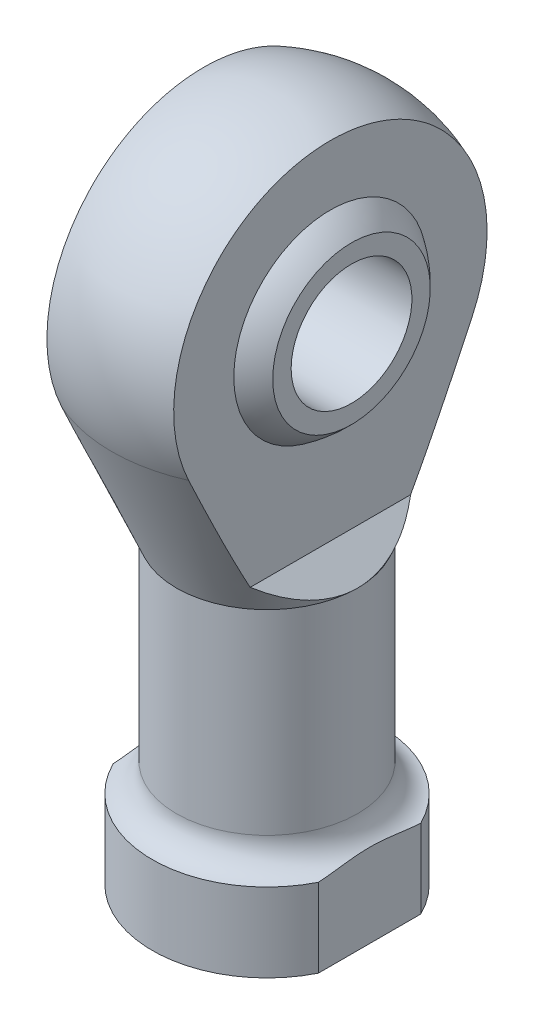
ISO-10303-21;
HEADER;
FILE_DESCRIPTION(('STEP AP214'),'2;1');
FILE_NAME('part.step','',(''),(''),'','','');
FILE_SCHEMA(('AUTOMOTIVE_DESIGN { 1 0 10303 214 1 1 1 1 }'));
ENDSEC;
DATA;
#1=APPLICATION_CONTEXT('core data for automotive mechanical design processes');
#2=APPLICATION_PROTOCOL_DEFINITION('international standard','automotive_design',2000,#1);
#3=PRODUCT_CONTEXT('',#1,'mechanical');
#4=PRODUCT('Part','Part','',(#3));
#5=PRODUCT_RELATED_PRODUCT_CATEGORY('part','',(#4));
#6=PRODUCT_DEFINITION_FORMATION('','',#4);
#7=PRODUCT_DEFINITION_CONTEXT('part definition',#1,'design');
#8=PRODUCT_DEFINITION('design','',#6,#7);
#9=PRODUCT_DEFINITION_SHAPE('','',#8);
#10=(LENGTH_UNIT() NAMED_UNIT(*) SI_UNIT(.MILLI.,.METRE.));
#11=(NAMED_UNIT(*) PLANE_ANGLE_UNIT() SI_UNIT($,.RADIAN.));
#12=(NAMED_UNIT(*) SI_UNIT($,.STERADIAN.) SOLID_ANGLE_UNIT());
#13=UNCERTAINTY_MEASURE_WITH_UNIT(LENGTH_MEASURE(1.E-05),#10,'distance_accuracy_value','');
#14=(GEOMETRIC_REPRESENTATION_CONTEXT(3) GLOBAL_UNCERTAINTY_ASSIGNED_CONTEXT((#13)) GLOBAL_UNIT_ASSIGNED_CONTEXT((#10,
#11,#12)) REPRESENTATION_CONTEXT('',''));
#15=CARTESIAN_POINT('',(0.,0.,0.));
#16=DIRECTION('',(0.,0.,1.));
#17=DIRECTION('',(1.,0.,0.));
#18=AXIS2_PLACEMENT_3D('',#15,#16,#17);
#19=CARTESIAN_POINT('',(0.,-18.,0.));
#20=DIRECTION('',(0.,1.,0.));
#21=DIRECTION('',(-1.,0.,0.));
#22=AXIS2_PLACEMENT_3D('',#19,#20,#21);
#23=CONICAL_SURFACE('',#22,7.5,0.4060598652);
#24=CARTESIAN_POINT('',(5.25,-15.7500000000467,-6.64336751220229));
#25=CARTESIAN_POINT('',(5.25,-15.5412590257444,-6.75775113915597));
#26=CARTESIAN_POINT('',(5.25,-15.3320480179548,-6.87127233524981));
#27=CARTESIAN_POINT('',(5.25,-14.912804278486,-7.09678085794804));
#28=CARTESIAN_POINT('',(5.25,-14.7027715579267,-7.20876820521779));
#29=CARTESIAN_POINT('',(5.25,-14.0716343283759,-7.54270760242626));
#30=CARTESIAN_POINT('',(5.25,-13.6494664583307,-7.76265026018883));
#31=CARTESIAN_POINT('',(5.25,-12.8030438016763,-8.1982578120738));
#32=CARTESIAN_POINT('',(5.25,-12.3787894551956,-8.4139235638256));
#33=CARTESIAN_POINT('',(5.25,-11.5285564067598,-8.84184299491973));
#34=CARTESIAN_POINT('',(5.25,-11.10257767613,-9.05409661722797));
#35=CARTESIAN_POINT('',(5.25,-10.2492963603601,-9.47577483803386));
#36=CARTESIAN_POINT('',(5.25,-9.82199396414635,-9.68519981928349));
#37=CARTESIAN_POINT('',(5.25,-8.96625569386359,-10.1017217124101));
#38=CARTESIAN_POINT('',(5.25,-8.53781981728141,-10.3088186191199));
#39=CARTESIAN_POINT('',(5.25,-7.67992187110538,-10.7210980371679));
#40=CARTESIAN_POINT('',(5.25,-7.25045961116055,-10.9262801520782));
#41=CARTESIAN_POINT('',(5.25,-6.39073962061324,-11.3349683103631));
#42=CARTESIAN_POINT('',(5.25,-5.96048189230328,-11.5384743585589));
#43=CARTESIAN_POINT('',(5.25,-5.52989728921774,-11.7412834044279));
#44=B_SPLINE_CURVE_WITH_KNOTS('',3,(#24,#25,#26,#27,#28,#29,#30,#31,#32,#33,#34,#35,#36,#37,#38,
#39,#40,#41,#42,#43),.UNSPECIFIED.,.F.,.F.,(4,2,2,2,2,2,2,2,2,4),(0.,0.714072715805614,
1.42813580150958,2.85617896135151,4.28393280564249,5.71171049021998,7.1392930023336,
8.56687868238732,9.99475364183123,11.4226244925431),.UNSPECIFIED.);
#45=CARTESIAN_POINT('',(5.25,-15.7500000000233,-6.64336751215668));
#46=VERTEX_POINT('',#45);
#47=CARTESIAN_POINT('',(5.25,-5.52989728911602,-11.7412834042074));
#48=VERTEX_POINT('',#47);
#49=EDGE_CURVE('E197',#46,#48,#44,.T.);
#50=ORIENTED_EDGE('',*,*,#49,.F.);
#51=CARTESIAN_POINT('',(-5.65685016786956,-4.84314983213044,0.));
#52=DIRECTION('',(0.707106781186548,0.707106781186548,0.));
#53=DIRECTION('',(-0.707106781186548,0.707106781186548,0.));
#54=AXIS2_PLACEMENT_3D('',#51,#52,#53);
#55=ELLIPSE('',#54,18.6065959455,11.8786679606);
#56=CARTESIAN_POINT('',(7.5,-18.,0.));
#57=VERTEX_POINT('',#56);
#58=EDGE_CURVE('E32',#57,#46,#55,.T.);
#59=ORIENTED_EDGE('',*,*,#58,.F.);
#60=CARTESIAN_POINT('',(0.,-18.,0.));
#61=DIRECTION('',(0.,1.,0.));
#62=DIRECTION('',(-1.,0.,0.));
#63=AXIS2_PLACEMENT_3D('',#60,#61,#62);
#64=CIRCLE('',#63,7.5);
#65=CARTESIAN_POINT('',(-7.5,-18.,0.));
#66=VERTEX_POINT('',#65);
#67=EDGE_CURVE('E317',#57,#66,#64,.T.);
#68=ORIENTED_EDGE('',*,*,#67,.T.);
#69=CARTESIAN_POINT('',(5.65685016786956,-4.84314983213044,0.));
#70=DIRECTION('',(-0.707106781186548,0.707106781186548,0.));
#71=DIRECTION('',(0.707106781186548,0.707106781186548,0.));
#72=AXIS2_PLACEMENT_3D('',#69,#70,#71);
#73=ELLIPSE('',#72,18.6065959455,11.8786679606);
#74=CARTESIAN_POINT('',(-5.25,-15.75,-6.64336751216948));
#75=VERTEX_POINT('',#74);
#76=EDGE_CURVE('E182',#75,#66,#73,.T.);
#77=ORIENTED_EDGE('',*,*,#76,.F.);
#78=CARTESIAN_POINT('',(-5.25,-5.52989728921774,-11.7412834044279));
#79=CARTESIAN_POINT('',(-5.25,-5.96048189230329,-11.5384743585589));
#80=CARTESIAN_POINT('',(-5.25,-6.39073962061324,-11.3349683103631));
#81=CARTESIAN_POINT('',(-5.25,-7.25045961116055,-10.9262801520782));
#82=CARTESIAN_POINT('',(-5.25,-7.67992187110538,-10.7210980371679));
#83=CARTESIAN_POINT('',(-5.25,-8.53781981728141,-10.3088186191199));
#84=CARTESIAN_POINT('',(-5.25,-8.96625569386359,-10.1017217124101));
#85=CARTESIAN_POINT('',(-5.25,-9.82199396414635,-9.68519981928349));
#86=CARTESIAN_POINT('',(-5.25,-10.2492963603601,-9.47577483803386));
#87=CARTESIAN_POINT('',(-5.25,-11.10257767613,-9.05409661722797));
#88=CARTESIAN_POINT('',(-5.25,-11.5285564067598,-8.84184299491973));
#89=CARTESIAN_POINT('',(-5.25,-12.3787894551956,-8.41392356382561));
#90=CARTESIAN_POINT('',(-5.25,-12.8030438016763,-8.19825781207381));
#91=CARTESIAN_POINT('',(-5.25,-13.6494664583307,-7.76265026018883));
#92=CARTESIAN_POINT('',(-5.25,-14.0716343283759,-7.54270760242626));
#93=CARTESIAN_POINT('',(-5.25,-14.7027715579267,-7.20876820521779));
#94=CARTESIAN_POINT('',(-5.25,-14.912804278486,-7.09678085794804));
#95=CARTESIAN_POINT('',(-5.25,-15.3320480179548,-6.87127233524981));
#96=CARTESIAN_POINT('',(-5.25,-15.5412590257444,-6.75775113915597));
#97=CARTESIAN_POINT('',(-5.25,-15.7500000000467,-6.64336751220229));
#98=B_SPLINE_CURVE_WITH_KNOTS('',3,(#78,#79,#80,#81,#82,#83,#84,#85,#86,#87,#88,#89,#90,#91,#92,
#93,#94,#95,#96,#97),.UNSPECIFIED.,.F.,.F.,(4,2,2,2,2,2,2,2,2,4),(0.,1.42787085071188,
2.8557458101558,4.28333149020951,5.71091400232313,7.13869168690062,8.5664455311916,
9.99448869103353,10.7085517767375,11.4226244925431),.UNSPECIFIED.);
#99=CARTESIAN_POINT('',(-5.25,-5.52989728911602,-11.7412834042074));
#100=VERTEX_POINT('',#99);
#101=EDGE_CURVE('E191',#100,#75,#98,.T.);
#102=ORIENTED_EDGE('',*,*,#101,.F.);
#103=CARTESIAN_POINT('',(0.,-5.5298972890143,0.));
#104=DIRECTION('',(0.,1.,0.));
#105=DIRECTION('',(-1.,0.,0.));
#106=AXIS2_PLACEMENT_3D('',#103,#104,#105);
#107=CIRCLE('',#106,12.8615798397);
#108=EDGE_CURVE('E159',#48,#100,#107,.T.);
#109=ORIENTED_EDGE('',*,*,#108,.F.);
#110=EDGE_LOOP('',(#50,#59,#68,#77,#102,#109));
#111=FACE_BOUND('',#110,.T.);
#112=ADVANCED_FACE('F15',(#111),#23,.T.);
#113=CARTESIAN_POINT('',(0.,-33.25,0.));
#114=DIRECTION('',(0.,1.,0.));
#115=DIRECTION('',(0.,0.,-1.));
#116=AXIS2_PLACEMENT_3D('',#113,#114,#115);
#117=CYLINDRICAL_SURFACE('',#116,9.5);
#118=DIRECTION('',(0.,-1.,0.));
#119=VECTOR('',#118,1.);
#120=CARTESIAN_POINT('',(-8.5,-33.25,4.24264068711929));
#121=LINE('',#120,#119);
#122=CARTESIAN_POINT('',(-8.5,-36.4784748002549,4.24264068711929));
#123=VERTEX_POINT('',#122);
#124=CARTESIAN_POINT('',(-8.5,-43.,4.24264068711929));
#125=VERTEX_POINT('',#124);
#126=EDGE_CURVE('E168',#123,#125,#121,.T.);
#127=ORIENTED_EDGE('',*,*,#126,.T.);
#128=CARTESIAN_POINT('',(0.,-43.,0.));
#129=DIRECTION('',(0.,1.,0.));
#130=DIRECTION('',(1.,0.,0.));
#131=AXIS2_PLACEMENT_3D('',#128,#129,#130);
#132=CIRCLE('',#131,9.5);
#133=CARTESIAN_POINT('',(8.5,-43.,4.24264068711929));
#134=VERTEX_POINT('',#133);
#135=EDGE_CURVE('E10',#125,#134,#132,.T.);
#136=ORIENTED_EDGE('',*,*,#135,.T.);
#137=DIRECTION('',(0.,-1.,0.));
#138=VECTOR('',#137,1.);
#139=CARTESIAN_POINT('',(8.5,-33.25,4.24264068711929));
#140=LINE('',#139,#138);
#141=CARTESIAN_POINT('',(8.5,-36.4784748002446,4.24264068711992));
#142=VERTEX_POINT('',#141);
#143=EDGE_CURVE('E347',#142,#134,#140,.T.);
#144=ORIENTED_EDGE('',*,*,#143,.F.);
#145=CARTESIAN_POINT('',(0.,-36.4784748002549,0.));
#146=DIRECTION('',(0.,1.,0.));
#147=DIRECTION('',(-1.,0.,0.));
#148=AXIS2_PLACEMENT_3D('',#145,#146,#147);
#149=CIRCLE('',#148,9.5);
#150=EDGE_CURVE('E225',#123,#142,#149,.T.);
#151=ORIENTED_EDGE('',*,*,#150,.F.);
#152=EDGE_LOOP('',(#127,#136,#144,#151));
#153=FACE_BOUND('',#152,.T.);
#154=ADVANCED_FACE('F283',(#153),#117,.T.);
#155=CARTESIAN_POINT('',(0.,-43.,0.));
#156=DIRECTION('',(0.,1.,0.));
#157=DIRECTION('',(1.,0.,0.));
#158=AXIS2_PLACEMENT_3D('',#155,#156,#157);
#159=PLANE('',#158);
#160=CARTESIAN_POINT('',(0.,-43.,0.));
#161=DIRECTION('',(0.,1.,0.));
#162=DIRECTION('',(0.,0.,1.));
#163=AXIS2_PLACEMENT_3D('',#160,#161,#162);
#164=CIRCLE('',#163,5.);
#165=CARTESIAN_POINT('',(0.,-43.,5.));
#166=VERTEX_POINT('',#165);
#167=EDGE_CURVE('E351',#166,#166,#164,.T.);
#168=ORIENTED_EDGE('',*,*,#167,.T.);
#169=EDGE_LOOP('',(#168));
#170=FACE_BOUND('',#169,.T.);
#171=ORIENTED_EDGE('',*,*,#135,.F.);
#172=DIRECTION('',(0.,0.,1.));
#173=VECTOR('',#172,1.);
#174=CARTESIAN_POINT('',(-8.5,-43.,-4.24264068711928));
#175=LINE('',#174,#173);
#176=CARTESIAN_POINT('',(-8.5,-43.,-4.24264068711928));
#177=VERTEX_POINT('',#176);
#178=EDGE_CURVE('E178',#177,#125,#175,.T.);
#179=ORIENTED_EDGE('',*,*,#178,.F.);
#180=CARTESIAN_POINT('',(0.,-43.,0.));
#181=DIRECTION('',(0.,1.,0.));
#182=DIRECTION('',(1.,0.,0.));
#183=AXIS2_PLACEMENT_3D('',#180,#181,#182);
#184=CIRCLE('',#183,9.5);
#185=CARTESIAN_POINT('',(8.5,-43.,-4.24264068711928));
#186=VERTEX_POINT('',#185);
#187=EDGE_CURVE('E339',#186,#177,#184,.T.);
#188=ORIENTED_EDGE('',*,*,#187,.F.);
#189=DIRECTION('',(0.,0.,-1.));
#190=VECTOR('',#189,1.);
#191=CARTESIAN_POINT('',(8.5,-43.,4.24264068711928));
#192=LINE('',#191,#190);
#193=EDGE_CURVE('E226',#134,#186,#192,.T.);
#194=ORIENTED_EDGE('',*,*,#193,.F.);
#195=EDGE_LOOP('',(#171,#179,#188,#194));
#196=FACE_BOUND('',#195,.T.);
#197=ADVANCED_FACE('F289',(#170,#196),#159,.F.);
#198=CARTESIAN_POINT('',(5.25,-15.75,14.));
#199=DIRECTION('',(0.707106781186548,0.707106781186548,0.));
#200=DIRECTION('',(0.,0.,-1.));
#201=AXIS2_PLACEMENT_3D('',#198,#199,#200);
#202=PLANE('',#201);
#203=CARTESIAN_POINT('',(-5.65685016786956,-4.84314983213044,0.));
#204=DIRECTION('',(0.707106781186548,0.707106781186548,0.));
#205=DIRECTION('',(-0.707106781186548,0.707106781186548,0.));
#206=AXIS2_PLACEMENT_3D('',#203,#204,#205);
#207=ELLIPSE('',#206,18.6065959455,11.8786679606);
#208=CARTESIAN_POINT('',(5.25,-15.75,6.6433675121695));
#209=VERTEX_POINT('',#208);
#210=EDGE_CURVE('E198',#209,#57,#207,.T.);
#211=ORIENTED_EDGE('',*,*,#210,.T.);
#212=ORIENTED_EDGE('',*,*,#58,.T.);
#213=DIRECTION('',(0.,0.,-1.));
#214=VECTOR('',#213,1.);
#215=CARTESIAN_POINT('',(5.25,-15.75,14.));
#216=LINE('',#215,#214);
#217=EDGE_CURVE('E193',#209,#46,#216,.T.);
#218=ORIENTED_EDGE('',*,*,#217,.F.);
#219=EDGE_LOOP('',(#211,#212,#218));
#220=FACE_BOUND('',#219,.T.);
#221=ADVANCED_FACE('F285',(#220),#202,.T.);
#222=CARTESIAN_POINT('',(-5.,-18.,0.));
#223=DIRECTION('',(0.,-1.,0.));
#224=DIRECTION('',(0.,0.,-1.));
#225=AXIS2_PLACEMENT_3D('',#222,#223,#224);
#226=PLANE('',#225);
#227=CARTESIAN_POINT('',(0.,-18.,0.));
#228=DIRECTION('',(0.,1.,0.));
#229=DIRECTION('',(0.,0.,1.));
#230=AXIS2_PLACEMENT_3D('',#227,#228,#229);
#231=CIRCLE('',#230,5.);
#232=CARTESIAN_POINT('',(0.,-18.,5.));
#233=VERTEX_POINT('',#232);
#234=EDGE_CURVE('E44',#233,#233,#231,.T.);
#235=ORIENTED_EDGE('',*,*,#234,.F.);
#236=EDGE_LOOP('',(#235));
#237=FACE_BOUND('',#236,.T.);
#238=ADVANCED_FACE('F288',(#237),#226,.T.);
#239=CARTESIAN_POINT('',(0.,-18.812,0.));
#240=DIRECTION('',(0.,1.,0.));
#241=DIRECTION('',(0.,0.,1.));
#242=AXIS2_PLACEMENT_3D('',#239,#240,#241);
#243=CONICAL_SURFACE('',#242,4.188,0.7853981634);
#244=CARTESIAN_POINT('',(0.,-18.812,0.));
#245=DIRECTION('',(0.,1.,0.));
#246=DIRECTION('',(0.,0.,1.));
#247=AXIS2_PLACEMENT_3D('',#244,#245,#246);
#248=CIRCLE('',#247,4.188);
#249=CARTESIAN_POINT('',(0.,-18.812,4.188));
#250=VERTEX_POINT('',#249);
#251=EDGE_CURVE('E319',#250,#250,#248,.T.);
#252=ORIENTED_EDGE('',*,*,#251,.F.);
#253=EDGE_LOOP('',(#252));
#254=FACE_BOUND('',#253,.T.);
#255=ORIENTED_EDGE('',*,*,#234,.T.);
#256=EDGE_LOOP('',(#255));
#257=FACE_BOUND('',#256,.T.);
#258=ADVANCED_FACE('F252',(#254,#257),#243,.F.);
#259=CARTESIAN_POINT('',(0.,-15.8349364905389,0.));
#260=DIRECTION('',(0.,-1.,0.));
#261=DIRECTION('',(0.,0.,1.));
#262=AXIS2_PLACEMENT_3D('',#259,#260,#261);
#263=CYLINDRICAL_SURFACE('',#262,4.188);
#264=ORIENTED_EDGE('',*,*,#251,.T.);
#265=EDGE_LOOP('',(#264));
#266=FACE_BOUND('',#265,.T.);
#267=CARTESIAN_POINT('',(0.,-42.188,0.));
#268=DIRECTION('',(0.,1.,0.));
#269=DIRECTION('',(0.,0.,1.));
#270=AXIS2_PLACEMENT_3D('',#267,#268,#269);
#271=CIRCLE('',#270,4.188);
#272=CARTESIAN_POINT('',(0.,-42.188,4.188));
#273=VERTEX_POINT('',#272);
#274=EDGE_CURVE('E322',#273,#273,#271,.T.);
#275=ORIENTED_EDGE('',*,*,#274,.F.);
#276=EDGE_LOOP('',(#275));
#277=FACE_BOUND('',#276,.T.);
#278=ADVANCED_FACE('F466',(#266,#277),#263,.F.);
#279=CARTESIAN_POINT('',(0.,-43.,0.));
#280=DIRECTION('',(0.,-1.,0.));
#281=DIRECTION('',(0.,0.,-1.));
#282=AXIS2_PLACEMENT_3D('',#279,#280,#281);
#283=CONICAL_SURFACE('',#282,5.,0.7853981634);
#284=ORIENTED_EDGE('',*,*,#274,.T.);
#285=EDGE_LOOP('',(#284));
#286=FACE_BOUND('',#285,.T.);
#287=ORIENTED_EDGE('',*,*,#167,.F.);
#288=EDGE_LOOP('',(#287));
#289=FACE_BOUND('',#288,.T.);
#290=ADVANCED_FACE('F485',(#286,#289),#283,.F.);
#291=CARTESIAN_POINT('',(7.,14.,14.));
#292=DIRECTION('',(-1.,0.,0.));
#293=DIRECTION('',(0.,0.,1.));
#294=AXIS2_PLACEMENT_3D('',#291,#292,#293);
#295=PLANE('',#294);
#296=CARTESIAN_POINT('',(7.,0.,0.));
#297=DIRECTION('',(-1.,0.,0.));
#298=DIRECTION('',(0.,0.,1.));
#299=AXIS2_PLACEMENT_3D('',#296,#297,#298);
#300=CIRCLE('',#299,5.);
#301=CARTESIAN_POINT('',(7.,0.,5.));
#302=VERTEX_POINT('',#301);
#303=EDGE_CURVE('E337',#302,#302,#300,.T.);
#304=ORIENTED_EDGE('',*,*,#303,.T.);
#305=EDGE_LOOP('',(#304));
#306=FACE_BOUND('',#305,.T.);
#307=CARTESIAN_POINT('',(7.,0.,0.));
#308=DIRECTION('',(1.,0.,0.));
#309=DIRECTION('',(0.,0.,1.));
#310=AXIS2_PLACEMENT_3D('',#307,#308,#309);
#311=CIRCLE('',#310,6.5239941753);
#312=CARTESIAN_POINT('',(7.,0.,6.52399417534994));
#313=VERTEX_POINT('',#312);
#314=EDGE_CURVE('E332',#313,#313,#311,.T.);
#315=ORIENTED_EDGE('',*,*,#314,.T.);
#316=EDGE_LOOP('',(#315));
#317=FACE_BOUND('',#316,.T.);
#318=ADVANCED_FACE('F496',(#306,#317),#295,.F.);
#319=CARTESIAN_POINT('',(-7.,14.,-14.));
#320=DIRECTION('',(1.,0.,0.));
#321=DIRECTION('',(0.,1.,0.));
#322=AXIS2_PLACEMENT_3D('',#319,#320,#321);
#323=PLANE('',#322);
#324=CARTESIAN_POINT('',(-7.,0.,0.));
#325=DIRECTION('',(1.,0.,0.));
#326=DIRECTION('',(0.,0.,-1.));
#327=AXIS2_PLACEMENT_3D('',#324,#325,#326);
#328=CIRCLE('',#327,5.);
#329=CARTESIAN_POINT('',(-7.,0.,-5.));
#330=VERTEX_POINT('',#329);
#331=EDGE_CURVE('E331',#330,#330,#328,.T.);
#332=ORIENTED_EDGE('',*,*,#331,.T.);
#333=EDGE_LOOP('',(#332));
#334=FACE_BOUND('',#333,.T.);
#335=CARTESIAN_POINT('',(-7.,0.,0.));
#336=DIRECTION('',(-1.,0.,0.));
#337=DIRECTION('',(0.,0.,-1.));
#338=AXIS2_PLACEMENT_3D('',#335,#336,#337);
#339=CIRCLE('',#338,6.5239941753);
#340=CARTESIAN_POINT('',(-7.,0.,-6.52399417534994));
#341=VERTEX_POINT('',#340);
#342=EDGE_CURVE('E307',#341,#341,#339,.T.);
#343=ORIENTED_EDGE('',*,*,#342,.T.);
#344=EDGE_LOOP('',(#343));
#345=FACE_BOUND('',#344,.T.);
#346=ADVANCED_FACE('F17',(#334,#345),#323,.F.);
#347=CARTESIAN_POINT('',(10.,0.,0.));
#348=DIRECTION('',(1.,0.,0.));
#349=DIRECTION('',(0.,0.,1.));
#350=AXIS2_PLACEMENT_3D('',#347,#348,#349);
#351=CYLINDRICAL_SURFACE('',#350,5.);
#352=ORIENTED_EDGE('',*,*,#303,.F.);
#353=EDGE_LOOP('',(#352));
#354=FACE_BOUND('',#353,.T.);
#355=ORIENTED_EDGE('',*,*,#331,.F.);
#356=EDGE_LOOP('',(#355));
#357=FACE_BOUND('',#356,.T.);
#358=ADVANCED_FACE('F293',(#354,#357),#351,.F.);
#359=CARTESIAN_POINT('',(0.,0.,0.));
#360=DIRECTION('',(0.,1.,0.));
#361=DIRECTION('',(1.,0.,0.));
#362=AXIS2_PLACEMENT_3D('',#359,#360,#361);
#363=SPHERICAL_SURFACE('',#362,9.5688296045);
#364=CARTESIAN_POINT('',(0.,0.,0.));
#365=DIRECTION('',(-1.,0.,0.));
#366=DIRECTION('',(0.,0.,-1.));
#367=AXIS2_PLACEMENT_3D('',#364,#365,#366);
#368=SPHERICAL_SURFACE('',#367,9.5688296045);
#369=ORIENTED_EDGE('',*,*,#342,.F.);
#370=EDGE_LOOP('',(#369));
#371=FACE_BOUND('',#370,.T.);
#372=CARTESIAN_POINT('',(-5.25,0.,0.));
#373=DIRECTION('',(-1.,0.,0.));
#374=DIRECTION('',(0.,0.,1.));
#375=AXIS2_PLACEMENT_3D('',#372,#373,#374);
#376=CIRCLE('',#375,8.);
#377=CARTESIAN_POINT('',(-5.25,0.,8.));
#378=VERTEX_POINT('',#377);
#379=EDGE_CURVE('E186',#378,#378,#376,.T.);
#380=ORIENTED_EDGE('',*,*,#379,.T.);
#381=EDGE_LOOP('',(#380));
#382=FACE_BOUND('',#381,.T.);
#383=ADVANCED_FACE('F291',(#371,#382),#368,.T.);
#384=CARTESIAN_POINT('',(0.,0.,0.));
#385=DIRECTION('',(0.,1.,0.));
#386=DIRECTION('',(1.,0.,0.));
#387=AXIS2_PLACEMENT_3D('',#384,#385,#386);
#388=SPHERICAL_SURFACE('',#387,9.5688296045);
#389=CARTESIAN_POINT('',(0.,0.,0.));
#390=DIRECTION('',(1.,0.,0.));
#391=DIRECTION('',(0.,0.,1.));
#392=AXIS2_PLACEMENT_3D('',#389,#390,#391);
#393=SPHERICAL_SURFACE('',#392,9.5688296045);
#394=ORIENTED_EDGE('',*,*,#314,.F.);
#395=EDGE_LOOP('',(#394));
#396=FACE_BOUND('',#395,.T.);
#397=CARTESIAN_POINT('',(5.25,0.,0.));
#398=DIRECTION('',(1.,0.,0.));
#399=DIRECTION('',(0.,0.,-1.));
#400=AXIS2_PLACEMENT_3D('',#397,#398,#399);
#401=CIRCLE('',#400,8.);
#402=CARTESIAN_POINT('',(5.25,0.,-8.));
#403=VERTEX_POINT('',#402);
#404=EDGE_CURVE('E278',#403,#403,#401,.T.);
#405=ORIENTED_EDGE('',*,*,#404,.T.);
#406=EDGE_LOOP('',(#405));
#407=FACE_BOUND('',#406,.T.);
#408=ADVANCED_FACE('F270',(#396,#407),#393,.T.);
#409=CARTESIAN_POINT('',(0.,14.,0.));
#410=DIRECTION('',(0.,-1.,0.));
#411=DIRECTION('',(-1.,0.,0.));
#412=AXIS2_PLACEMENT_3D('',#409,#410,#411);
#413=CYLINDRICAL_SURFACE('',#412,7.5);
#414=CARTESIAN_POINT('',(0.,-18.,0.));
#415=DIRECTION('',(0.,1.,0.));
#416=DIRECTION('',(-1.,0.,0.));
#417=AXIS2_PLACEMENT_3D('',#414,#415,#416);
#418=CIRCLE('',#417,7.5);
#419=EDGE_CURVE('E206',#66,#57,#418,.T.);
#420=ORIENTED_EDGE('',*,*,#419,.F.);
#421=ORIENTED_EDGE('',*,*,#67,.F.);
#422=EDGE_LOOP('',(#420,#421));
#423=FACE_BOUND('',#422,.T.);
#424=CARTESIAN_POINT('',(0.,-34.1850454237764,0.));
#425=DIRECTION('',(0.,1.,0.));
#426=DIRECTION('',(-1.,0.,0.));
#427=AXIS2_PLACEMENT_3D('',#424,#425,#426);
#428=CIRCLE('',#427,7.5);
#429=CARTESIAN_POINT('',(-7.5,-34.1850454237764,0.));
#430=VERTEX_POINT('',#429);
#431=EDGE_CURVE('E348',#430,#430,#428,.T.);
#432=ORIENTED_EDGE('',*,*,#431,.T.);
#433=EDGE_LOOP('',(#432));
#434=FACE_BOUND('',#433,.T.);
#435=ADVANCED_FACE('F301',(#423,#434),#413,.T.);
#436=CARTESIAN_POINT('',(0.,-34.1850454237764,0.));
#437=DIRECTION('',(0.,1.,0.));
#438=DIRECTION('',(-1.,0.,0.));
#439=AXIS2_PLACEMENT_3D('',#436,#437,#438);
#440=TOROIDAL_SURFACE('',#439,9.8149545762,2.3149545762);
#441=ORIENTED_EDGE('',*,*,#431,.F.);
#442=EDGE_LOOP('',(#441));
#443=FACE_BOUND('',#442,.T.);
#444=CARTESIAN_POINT('',(8.5,-36.4784748002344,4.24264068712055));
#445=CARTESIAN_POINT('',(8.5,-36.4666149069385,4.04935665352344));
#446=CARTESIAN_POINT('',(8.5,-36.4504767796362,3.85643593331129));
#447=CARTESIAN_POINT('',(8.5,-36.4125412736801,3.47125727403706));
#448=CARTESIAN_POINT('',(8.5,-36.3907473822892,3.2789990002781));
#449=CARTESIAN_POINT('',(8.5,-36.3442375166872,2.89369784536625));
#450=CARTESIAN_POINT('',(8.5,-36.3195048813148,2.70065712843891));
#451=CARTESIAN_POINT('',(8.5,-36.2701643561931,2.31452111904356));
#452=CARTESIAN_POINT('',(8.5,-36.2455564893502,2.12142582296882));
#453=CARTESIAN_POINT('',(8.5,-36.1996807724495,1.73694609551491));
#454=CARTESIAN_POINT('',(8.5,-36.1783796215619,1.54556579633546));
#455=CARTESIAN_POINT('',(8.5,-36.1415104329331,1.16225352947779));
#456=CARTESIAN_POINT('',(8.5,-36.1259416396938,0.970321637859601));
#457=CARTESIAN_POINT('',(8.5,-36.1027498326417,0.586625995944704));
#458=CARTESIAN_POINT('',(8.5,-36.0950993365976,0.394863987789196));
#459=CARTESIAN_POINT('',(8.5,-36.0887974874233,0.0111865199834715));
#460=CARTESIAN_POINT('',(8.5,-36.0901459672344,-0.180728936751966));
#461=CARTESIAN_POINT('',(8.5,-36.100699907947,-0.533550797265403));
#462=CARTESIAN_POINT('',(8.5,-36.1086118757235,-0.694498799692882));
#463=CARTESIAN_POINT('',(8.5,-36.1297823082593,-1.01603536371121));
#464=CARTESIAN_POINT('',(8.5,-36.1430408727953,-1.17662391853791));
#465=CARTESIAN_POINT('',(8.5,-36.1736566129325,-1.49785811113369));
#466=CARTESIAN_POINT('',(8.5,-36.1910253349698,-1.65850261294287));
#467=CARTESIAN_POINT('',(8.5,-36.2282676452726,-1.9795048617274));
#468=CARTESIAN_POINT('',(8.5,-36.2481414471522,-2.13986258306421));
#469=CARTESIAN_POINT('',(8.5,-36.3093827428385,-2.62387980453893));
#470=CARTESIAN_POINT('',(8.5,-36.3520101707151,-2.9473833733787));
#471=CARTESIAN_POINT('',(8.5,-36.4079668360322,-3.43297336262301));
#472=CARTESIAN_POINT('',(8.5,-36.4252621697122,-3.59457531278269));
#473=CARTESIAN_POINT('',(8.5,-36.4555372054551,-3.9182525715814));
#474=CARTESIAN_POINT('',(8.5,-36.4685148589143,-4.08032806821837));
#475=CARTESIAN_POINT('',(8.5,-36.4784748002344,-4.24264068712054));
#476=B_SPLINE_CURVE_WITH_KNOTS('',3,(#444,#445,#446,#447,#448,#449,#450,#451,#452,#453,#454,
#455,#456,#457,#458,#459,#460,#461,#462,#463,#464,#465,#466,#467,#468,#469,#470,#471,#472,#473,
#474,#475),.UNSPECIFIED.,.F.,.F.,(4,2,2,2,2,2,2,2,2,2,2,2,2,2,2,4),(0.,0.580755986290107,
1.16115473406219,1.7450169536904,2.32898274277822,2.90662112873277,3.48418335737342,
4.05973423516124,4.63527442834843,5.11859938232138,5.60193335638038,6.08664159898923,
6.57139120184859,7.55025251450949,8.03777526851947,8.52552900797597),.UNSPECIFIED.);
#477=CARTESIAN_POINT('',(8.5,-36.4784748002446,-4.24264068711991));
#478=VERTEX_POINT('',#477);
#479=EDGE_CURVE('E217',#142,#478,#476,.T.);
#480=ORIENTED_EDGE('',*,*,#479,.T.);
#481=CARTESIAN_POINT('',(0.,-36.4784748002549,0.));
#482=DIRECTION('',(0.,1.,0.));
#483=DIRECTION('',(-1.,0.,0.));
#484=AXIS2_PLACEMENT_3D('',#481,#482,#483);
#485=CIRCLE('',#484,9.5);
#486=CARTESIAN_POINT('',(-8.5,-36.4784748002549,-4.24264068711928));
#487=VERTEX_POINT('',#486);
#488=EDGE_CURVE('E141',#478,#487,#485,.T.);
#489=ORIENTED_EDGE('',*,*,#488,.T.);
#490=CARTESIAN_POINT('',(-8.5,-36.4784748002344,-4.24264068712054));
#491=CARTESIAN_POINT('',(-8.5,-36.4666149069384,-4.04935665352343));
#492=CARTESIAN_POINT('',(-8.5,-36.4504767796362,-3.85643593331128));
#493=CARTESIAN_POINT('',(-8.5,-36.4125412736801,-3.47125727403705));
#494=CARTESIAN_POINT('',(-8.5,-36.3907473822892,-3.27899900027809));
#495=CARTESIAN_POINT('',(-8.5,-36.3442375166872,-2.89369784536624));
#496=CARTESIAN_POINT('',(-8.5,-36.3195048813148,-2.7006571284389));
#497=CARTESIAN_POINT('',(-8.5,-36.2701643561931,-2.31452111904356));
#498=CARTESIAN_POINT('',(-8.5,-36.2455564893502,-2.12142582296881));
#499=CARTESIAN_POINT('',(-8.5,-36.1996807724495,-1.7369460955149));
#500=CARTESIAN_POINT('',(-8.5,-36.1783796215619,-1.54556579633545));
#501=CARTESIAN_POINT('',(-8.5,-36.141510432933,-1.16225352947778));
#502=CARTESIAN_POINT('',(-8.5,-36.1259416396938,-0.97032163785959));
#503=CARTESIAN_POINT('',(-8.5,-36.1027498326417,-0.586625995944693));
#504=CARTESIAN_POINT('',(-8.5,-36.0950993365976,-0.394863987789185));
#505=CARTESIAN_POINT('',(-8.5,-36.0887974874233,-0.0111865199834606));
#506=CARTESIAN_POINT('',(-8.5,-36.0901459672344,0.180728936751977));
#507=CARTESIAN_POINT('',(-8.5,-36.100699907947,0.533550797265413));
#508=CARTESIAN_POINT('',(-8.5,-36.1086118757235,0.694498799692893));
#509=CARTESIAN_POINT('',(-8.5,-36.1297823082593,1.01603536371122));
#510=CARTESIAN_POINT('',(-8.5,-36.1430408727953,1.17662391853792));
#511=CARTESIAN_POINT('',(-8.5,-36.1736566129325,1.4978581111337));
#512=CARTESIAN_POINT('',(-8.5,-36.1910253349698,1.65850261294288));
#513=CARTESIAN_POINT('',(-8.5,-36.2282676452726,1.97950486172741));
#514=CARTESIAN_POINT('',(-8.5,-36.2481414471522,2.13986258306422));
#515=CARTESIAN_POINT('',(-8.5,-36.3093827428385,2.62387980453894));
#516=CARTESIAN_POINT('',(-8.5,-36.3520101707151,2.94738337337871));
#517=CARTESIAN_POINT('',(-8.5,-36.4079668360322,3.43297336262302));
#518=CARTESIAN_POINT('',(-8.5,-36.4252621697122,3.5945753127827));
#519=CARTESIAN_POINT('',(-8.5,-36.4555372054551,3.91825257158141));
#520=CARTESIAN_POINT('',(-8.5,-36.4685148589143,4.08032806821838));
#521=CARTESIAN_POINT('',(-8.5,-36.4784748002344,4.24264068712055));
#522=B_SPLINE_CURVE_WITH_KNOTS('',3,(#490,#491,#492,#493,#494,#495,#496,#497,#498,#499,#500,
#501,#502,#503,#504,#505,#506,#507,#508,#509,#510,#511,#512,#513,#514,#515,#516,#517,#518,#519,
#520,#521),.UNSPECIFIED.,.F.,.F.,(4,2,2,2,2,2,2,2,2,2,2,2,2,2,2,4),(0.,0.580755986290108,
1.16115473406219,1.7450169536904,2.32898274277822,2.90662112873277,3.48418335737342,
4.05973423516124,4.63527442834843,5.11859938232138,5.60193335638038,6.08664159898923,
6.57139120184859,7.55025251450949,8.03777526851947,8.52552900797597),.UNSPECIFIED.);
#523=EDGE_CURVE('E19',#487,#123,#522,.T.);
#524=ORIENTED_EDGE('',*,*,#523,.T.);
#525=ORIENTED_EDGE('',*,*,#150,.T.);
#526=EDGE_LOOP('',(#480,#489,#524,#525));
#527=FACE_BOUND('',#526,.T.);
#528=ADVANCED_FACE('F234',(#443,#527),#440,.F.);
#529=CARTESIAN_POINT('',(8.5,-33.25,4.24264068711928));
#530=DIRECTION('',(-1.,0.,0.));
#531=DIRECTION('',(0.,0.,1.));
#532=AXIS2_PLACEMENT_3D('',#529,#530,#531);
#533=PLANE('',#532);
#534=ORIENTED_EDGE('',*,*,#143,.T.);
#535=ORIENTED_EDGE('',*,*,#193,.T.);
#536=DIRECTION('',(0.,-1.,0.));
#537=VECTOR('',#536,1.);
#538=CARTESIAN_POINT('',(8.5,-33.25,-4.24264068711928));
#539=LINE('',#538,#537);
#540=EDGE_CURVE('E185',#478,#186,#539,.T.);
#541=ORIENTED_EDGE('',*,*,#540,.F.);
#542=ORIENTED_EDGE('',*,*,#479,.F.);
#543=EDGE_LOOP('',(#534,#535,#541,#542));
#544=FACE_BOUND('',#543,.T.);
#545=ADVANCED_FACE('F238',(#544),#533,.F.);
#546=CARTESIAN_POINT('',(0.,-33.25,0.));
#547=DIRECTION('',(0.,1.,0.));
#548=DIRECTION('',(0.,0.,-1.));
#549=AXIS2_PLACEMENT_3D('',#546,#547,#548);
#550=CYLINDRICAL_SURFACE('',#549,9.5);
#551=ORIENTED_EDGE('',*,*,#540,.T.);
#552=ORIENTED_EDGE('',*,*,#187,.T.);
#553=DIRECTION('',(0.,-1.,0.));
#554=VECTOR('',#553,1.);
#555=CARTESIAN_POINT('',(-8.5,-33.25,-4.24264068711928));
#556=LINE('',#555,#554);
#557=EDGE_CURVE('E213',#487,#177,#556,.T.);
#558=ORIENTED_EDGE('',*,*,#557,.F.);
#559=ORIENTED_EDGE('',*,*,#488,.F.);
#560=EDGE_LOOP('',(#551,#552,#558,#559));
#561=FACE_BOUND('',#560,.T.);
#562=ADVANCED_FACE('F242',(#561),#550,.T.);
#563=CARTESIAN_POINT('',(-7.5,-18.,14.));
#564=DIRECTION('',(-0.707106781186548,0.707106781186548,0.));
#565=DIRECTION('',(0.,0.,1.));
#566=AXIS2_PLACEMENT_3D('',#563,#564,#565);
#567=PLANE('',#566);
#568=ORIENTED_EDGE('',*,*,#76,.T.);
#569=CARTESIAN_POINT('',(5.65685016786956,-4.84314983213044,0.));
#570=DIRECTION('',(-0.707106781186548,0.707106781186548,0.));
#571=DIRECTION('',(0.707106781186548,0.707106781186548,0.));
#572=AXIS2_PLACEMENT_3D('',#569,#570,#571);
#573=ELLIPSE('',#572,18.6065959455,11.8786679606);
#574=CARTESIAN_POINT('',(-5.25,-15.75,6.6433675121695));
#575=VERTEX_POINT('',#574);
#576=EDGE_CURVE('E202',#66,#575,#573,.T.);
#577=ORIENTED_EDGE('',*,*,#576,.T.);
#578=DIRECTION('',(0.,0.,-1.));
#579=VECTOR('',#578,1.);
#580=CARTESIAN_POINT('',(-5.25,-15.75,14.));
#581=LINE('',#580,#579);
#582=EDGE_CURVE('E187',#575,#75,#581,.T.);
#583=ORIENTED_EDGE('',*,*,#582,.T.);
#584=EDGE_LOOP('',(#568,#577,#583));
#585=FACE_BOUND('',#584,.T.);
#586=ADVANCED_FACE('F402',(#585),#567,.T.);
#587=CARTESIAN_POINT('',(-5.25,-15.75,14.));
#588=DIRECTION('',(-1.,0.,0.));
#589=DIRECTION('',(0.,0.,1.));
#590=AXIS2_PLACEMENT_3D('',#587,#588,#589);
#591=PLANE('',#590);
#592=ORIENTED_EDGE('',*,*,#379,.F.);
#593=EDGE_LOOP('',(#592));
#594=FACE_BOUND('',#593,.T.);
#595=ORIENTED_EDGE('',*,*,#101,.T.);
#596=ORIENTED_EDGE('',*,*,#582,.F.);
#597=CARTESIAN_POINT('',(-5.25,-15.7500000000467,6.64336751220229));
#598=CARTESIAN_POINT('',(-5.25,-15.5412590257444,6.75775113915597));
#599=CARTESIAN_POINT('',(-5.25,-15.3320480179548,6.87127233524981));
#600=CARTESIAN_POINT('',(-5.25,-14.912804278486,7.09678085794804));
#601=CARTESIAN_POINT('',(-5.25,-14.7027715579267,7.20876820521779));
#602=CARTESIAN_POINT('',(-5.25,-14.0716343283759,7.54270760242626));
#603=CARTESIAN_POINT('',(-5.25,-13.6494664583307,7.76265026018883));
#604=CARTESIAN_POINT('',(-5.25,-12.8030438016763,8.1982578120738));
#605=CARTESIAN_POINT('',(-5.25,-12.3787894551956,8.4139235638256));
#606=CARTESIAN_POINT('',(-5.25,-11.5285564067598,8.84184299491973));
#607=CARTESIAN_POINT('',(-5.25,-11.10257767613,9.05409661722797));
#608=CARTESIAN_POINT('',(-5.25,-10.2492963603601,9.47577483803386));
#609=CARTESIAN_POINT('',(-5.25,-9.82199396414635,9.68519981928349));
#610=CARTESIAN_POINT('',(-5.25,-8.96625569386359,10.1017217124101));
#611=CARTESIAN_POINT('',(-5.25,-8.53781981728141,10.3088186191199));
#612=CARTESIAN_POINT('',(-5.25,-7.67992187110538,10.7210980371679));
#613=CARTESIAN_POINT('',(-5.25,-7.25045961116055,10.9262801520782));
#614=CARTESIAN_POINT('',(-5.25,-6.39073962061324,11.3349683103631));
#615=CARTESIAN_POINT('',(-5.25,-5.96048189230328,11.5384743585589));
#616=CARTESIAN_POINT('',(-5.25,-5.52989728921774,11.7412834044279));
#617=B_SPLINE_CURVE_WITH_KNOTS('',3,(#597,#598,#599,#600,#601,#602,#603,#604,#605,#606,#607,
#608,#609,#610,#611,#612,#613,#614,#615,#616),.UNSPECIFIED.,.F.,.F.,(4,2,2,2,2,2,2,2,2,4),(0.,
0.714072715805614,1.42813580150958,2.85617896135151,4.28393280564249,5.71171049021998,
7.1392930023336,8.56687868238732,9.99475364183123,11.4226244925431),.UNSPECIFIED.);
#618=CARTESIAN_POINT('',(-5.25,-5.52989728911602,11.7412834042074));
#619=VERTEX_POINT('',#618);
#620=EDGE_CURVE('E207',#575,#619,#617,.T.);
#621=ORIENTED_EDGE('',*,*,#620,.T.);
#622=CARTESIAN_POINT('',(-5.25,0.,0.));
#623=DIRECTION('',(1.,0.,0.));
#624=DIRECTION('',(0.,0.,1.));
#625=AXIS2_PLACEMENT_3D('',#622,#623,#624);
#626=CIRCLE('',#625,12.9783473524);
#627=EDGE_CURVE('E162',#100,#619,#626,.T.);
#628=ORIENTED_EDGE('',*,*,#627,.F.);
#629=EDGE_LOOP('',(#595,#596,#621,#628));
#630=FACE_BOUND('',#629,.T.);
#631=ADVANCED_FACE('F244',(#594,#630),#591,.T.);
#632=CARTESIAN_POINT('',(5.25,14.,14.));
#633=DIRECTION('',(1.,0.,0.));
#634=DIRECTION('',(0.,1.,0.));
#635=AXIS2_PLACEMENT_3D('',#632,#633,#634);
#636=PLANE('',#635);
#637=ORIENTED_EDGE('',*,*,#404,.F.);
#638=EDGE_LOOP('',(#637));
#639=FACE_BOUND('',#638,.T.);
#640=CARTESIAN_POINT('',(5.25,-5.52989728921774,11.7412834044279));
#641=CARTESIAN_POINT('',(5.25,-5.96048189230329,11.5384743585589));
#642=CARTESIAN_POINT('',(5.25,-6.39073962061324,11.3349683103631));
#643=CARTESIAN_POINT('',(5.25,-7.25045961116055,10.9262801520782));
#644=CARTESIAN_POINT('',(5.25,-7.67992187110538,10.7210980371679));
#645=CARTESIAN_POINT('',(5.25,-8.53781981728141,10.3088186191199));
#646=CARTESIAN_POINT('',(5.25,-8.96625569386359,10.1017217124101));
#647=CARTESIAN_POINT('',(5.25,-9.82199396414635,9.68519981928349));
#648=CARTESIAN_POINT('',(5.25,-10.2492963603601,9.47577483803386));
#649=CARTESIAN_POINT('',(5.25,-11.10257767613,9.05409661722797));
#650=CARTESIAN_POINT('',(5.25,-11.5285564067598,8.84184299491973));
#651=CARTESIAN_POINT('',(5.25,-12.3787894551956,8.41392356382561));
#652=CARTESIAN_POINT('',(5.25,-12.8030438016763,8.19825781207381));
#653=CARTESIAN_POINT('',(5.25,-13.6494664583307,7.76265026018883));
#654=CARTESIAN_POINT('',(5.25,-14.0716343283759,7.54270760242626));
#655=CARTESIAN_POINT('',(5.25,-14.7027715579267,7.20876820521779));
#656=CARTESIAN_POINT('',(5.25,-14.912804278486,7.09678085794804));
#657=CARTESIAN_POINT('',(5.25,-15.3320480179548,6.87127233524981));
#658=CARTESIAN_POINT('',(5.25,-15.5412590257444,6.75775113915597));
#659=CARTESIAN_POINT('',(5.25,-15.7500000000467,6.64336751220229));
#660=B_SPLINE_CURVE_WITH_KNOTS('',3,(#640,#641,#642,#643,#644,#645,#646,#647,#648,#649,#650,
#651,#652,#653,#654,#655,#656,#657,#658,#659),.UNSPECIFIED.,.F.,.F.,(4,2,2,2,2,2,2,2,2,4),(0.,
1.42787085071188,2.8557458101558,4.28333149020951,5.71091400232313,7.13869168690062,
8.5664455311916,9.99448869103353,10.7085517767375,11.4226244925431),.UNSPECIFIED.);
#661=CARTESIAN_POINT('',(5.25,-5.52989728911602,11.7412834042074));
#662=VERTEX_POINT('',#661);
#663=EDGE_CURVE('E201',#662,#209,#660,.T.);
#664=ORIENTED_EDGE('',*,*,#663,.T.);
#665=ORIENTED_EDGE('',*,*,#217,.T.);
#666=ORIENTED_EDGE('',*,*,#49,.T.);
#667=CARTESIAN_POINT('',(5.25,0.,0.));
#668=DIRECTION('',(-1.,0.,0.));
#669=DIRECTION('',(0.,0.,-1.));
#670=AXIS2_PLACEMENT_3D('',#667,#668,#669);
#671=CIRCLE('',#670,12.9783473524);
#672=EDGE_CURVE('E164',#662,#48,#671,.T.);
#673=ORIENTED_EDGE('',*,*,#672,.F.);
#674=EDGE_LOOP('',(#664,#665,#666,#673));
#675=FACE_BOUND('',#674,.T.);
#676=ADVANCED_FACE('F250',(#639,#675),#636,.T.);
#677=CARTESIAN_POINT('',(0.,-18.,0.));
#678=DIRECTION('',(0.,1.,0.));
#679=DIRECTION('',(-1.,0.,0.));
#680=AXIS2_PLACEMENT_3D('',#677,#678,#679);
#681=CONICAL_SURFACE('',#680,7.5,0.4060598652);
#682=ORIENTED_EDGE('',*,*,#663,.F.);
#683=CARTESIAN_POINT('',(0.,-5.5298972890143,0.));
#684=DIRECTION('',(0.,1.,0.));
#685=DIRECTION('',(-1.,0.,0.));
#686=AXIS2_PLACEMENT_3D('',#683,#684,#685);
#687=CIRCLE('',#686,12.8615798397);
#688=EDGE_CURVE('E174',#619,#662,#687,.T.);
#689=ORIENTED_EDGE('',*,*,#688,.F.);
#690=ORIENTED_EDGE('',*,*,#620,.F.);
#691=ORIENTED_EDGE('',*,*,#576,.F.);
#692=ORIENTED_EDGE('',*,*,#419,.T.);
#693=ORIENTED_EDGE('',*,*,#210,.F.);
#694=EDGE_LOOP('',(#682,#689,#690,#691,#692,#693));
#695=FACE_BOUND('',#694,.T.);
#696=ADVANCED_FACE('F153',(#695),#681,.T.);
#697=CARTESIAN_POINT('',(0.,0.,0.));
#698=DIRECTION('',(0.,1.,0.));
#699=DIRECTION('',(1.,0.,0.));
#700=AXIS2_PLACEMENT_3D('',#697,#698,#699);
#701=SPHERICAL_SURFACE('',#700,14.);
#702=CARTESIAN_POINT('',(0.,14.,0.));
#703=VERTEX_POINT('',#702);
#704=VERTEX_LOOP('',#703);
#705=FACE_BOUND('',#704,.T.);
#706=ORIENTED_EDGE('',*,*,#108,.T.);
#707=ORIENTED_EDGE('',*,*,#627,.T.);
#708=ORIENTED_EDGE('',*,*,#688,.T.);
#709=ORIENTED_EDGE('',*,*,#672,.T.);
#710=EDGE_LOOP('',(#706,#707,#708,#709));
#711=FACE_BOUND('',#710,.T.);
#712=ADVANCED_FACE('F149',(#705,#711),#701,.T.);
#713=CARTESIAN_POINT('',(-8.5,-33.25,-4.24264068711928));
#714=DIRECTION('',(1.,0.,0.));
#715=DIRECTION('',(0.,1.,0.));
#716=AXIS2_PLACEMENT_3D('',#713,#714,#715);
#717=PLANE('',#716);
#718=ORIENTED_EDGE('',*,*,#523,.F.);
#719=ORIENTED_EDGE('',*,*,#557,.T.);
#720=ORIENTED_EDGE('',*,*,#178,.T.);
#721=ORIENTED_EDGE('',*,*,#126,.F.);
#722=EDGE_LOOP('',(#718,#719,#720,#721));
#723=FACE_BOUND('',#722,.T.);
#724=ADVANCED_FACE('F152',(#723),#717,.F.);
#725=CLOSED_SHELL('',(#112,#154,#197,#221,#238,#258,#278,#290,#318,#346,#358,#383,#408,#435,
#528,#545,#562,#586,#631,#676,#696,#712,#724));
#726=MANIFOLD_SOLID_BREP('B1',#725);
#727=ADVANCED_BREP_SHAPE_REPRESENTATION('',(#18,#726),#14);
#728=SHAPE_DEFINITION_REPRESENTATION(#9,#727);
ENDSEC;
END-ISO-10303-21;
